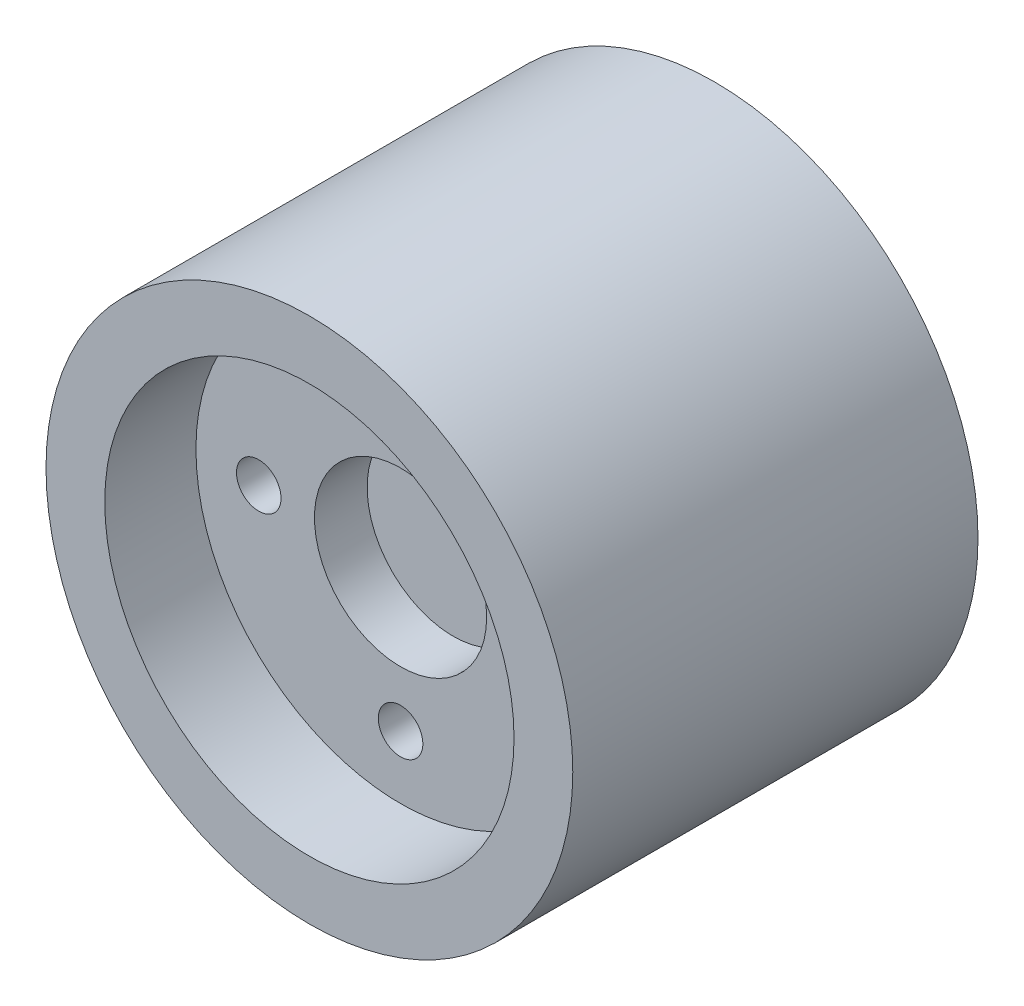
ISO-10303-21;
HEADER;
FILE_DESCRIPTION(('STEP AP214'),'2;1');
FILE_NAME('part.step','',(''),(''),'','','');
FILE_SCHEMA(('AUTOMOTIVE_DESIGN { 1 0 10303 214 1 1 1 1 }'));
ENDSEC;
DATA;
#1=APPLICATION_CONTEXT('core data for automotive mechanical design processes');
#2=APPLICATION_PROTOCOL_DEFINITION('international standard','automotive_design',2000,#1);
#3=PRODUCT_CONTEXT('',#1,'mechanical');
#4=PRODUCT('Part','Part','',(#3));
#5=PRODUCT_RELATED_PRODUCT_CATEGORY('part','',(#4));
#6=PRODUCT_DEFINITION_FORMATION('','',#4);
#7=PRODUCT_DEFINITION_CONTEXT('part definition',#1,'design');
#8=PRODUCT_DEFINITION('design','',#6,#7);
#9=PRODUCT_DEFINITION_SHAPE('','',#8);
#10=(LENGTH_UNIT() NAMED_UNIT(*) SI_UNIT(.MILLI.,.METRE.));
#11=(NAMED_UNIT(*) PLANE_ANGLE_UNIT() SI_UNIT($,.RADIAN.));
#12=(NAMED_UNIT(*) SI_UNIT($,.STERADIAN.) SOLID_ANGLE_UNIT());
#13=UNCERTAINTY_MEASURE_WITH_UNIT(LENGTH_MEASURE(1.E-05),#10,'distance_accuracy_value','');
#14=(GEOMETRIC_REPRESENTATION_CONTEXT(3) GLOBAL_UNCERTAINTY_ASSIGNED_CONTEXT((#13)) GLOBAL_UNIT_ASSIGNED_CONTEXT((#10,
#11,#12)) REPRESENTATION_CONTEXT('',''));
#15=CARTESIAN_POINT('',(0.,0.,0.));
#16=DIRECTION('',(0.,0.,1.));
#17=DIRECTION('',(1.,0.,0.));
#18=AXIS2_PLACEMENT_3D('',#15,#16,#17);
#19=CARTESIAN_POINT('',(0.,0.,20.));
#20=DIRECTION('',(0.,0.,-1.));
#21=DIRECTION('',(-1.,0.,0.));
#22=AXIS2_PLACEMENT_3D('',#19,#20,#21);
#23=CYLINDRICAL_SURFACE('',#22,13.);
#24=CARTESIAN_POINT('',(0.,0.,20.));
#25=DIRECTION('',(0.,0.,1.));
#26=DIRECTION('',(1.,0.,0.));
#27=AXIS2_PLACEMENT_3D('',#24,#25,#26);
#28=CIRCLE('',#27,13.);
#29=CARTESIAN_POINT('',(13.,0.,20.));
#30=VERTEX_POINT('',#29);
#31=EDGE_CURVE('E11',#30,#30,#28,.T.);
#32=ORIENTED_EDGE('',*,*,#31,.F.);
#33=EDGE_LOOP('',(#32));
#34=FACE_BOUND('',#33,.T.);
#35=CARTESIAN_POINT('',(0.,0.,0.));
#36=DIRECTION('',(0.,0.,1.));
#37=DIRECTION('',(1.,0.,0.));
#38=AXIS2_PLACEMENT_3D('',#35,#36,#37);
#39=CIRCLE('',#38,13.);
#40=CARTESIAN_POINT('',(13.,0.,0.));
#41=VERTEX_POINT('',#40);
#42=EDGE_CURVE('E52',#41,#41,#39,.T.);
#43=ORIENTED_EDGE('',*,*,#42,.T.);
#44=EDGE_LOOP('',(#43));
#45=FACE_BOUND('',#44,.T.);
#46=ADVANCED_FACE('F44',(#34,#45),#23,.T.);
#47=CARTESIAN_POINT('',(0.,0.,20.));
#48=DIRECTION('',(0.,0.,1.));
#49=DIRECTION('',(1.,0.,0.));
#50=AXIS2_PLACEMENT_3D('',#47,#48,#49);
#51=PLANE('',#50);
#52=CARTESIAN_POINT('',(0.,0.,20.));
#53=DIRECTION('',(0.,0.,1.));
#54=DIRECTION('',(1.,0.,0.));
#55=AXIS2_PLACEMENT_3D('',#52,#53,#54);
#56=CIRCLE('',#55,10.1);
#57=CARTESIAN_POINT('',(10.1,0.,20.));
#58=VERTEX_POINT('',#57);
#59=EDGE_CURVE('E61',#58,#58,#56,.T.);
#60=ORIENTED_EDGE('',*,*,#59,.F.);
#61=EDGE_LOOP('',(#60));
#62=FACE_BOUND('',#61,.T.);
#63=ORIENTED_EDGE('',*,*,#31,.T.);
#64=EDGE_LOOP('',(#63));
#65=FACE_BOUND('',#64,.T.);
#66=ADVANCED_FACE('F142',(#62,#65),#51,.T.);
#67=CARTESIAN_POINT('',(0.,0.,0.));
#68=DIRECTION('',(0.,0.,1.));
#69=DIRECTION('',(1.,0.,0.));
#70=AXIS2_PLACEMENT_3D('',#67,#68,#69);
#71=PLANE('',#70);
#72=CARTESIAN_POINT('',(6.,5.,0.));
#73=DIRECTION('',(0.,0.,-1.));
#74=DIRECTION('',(-1.,0.,0.));
#75=AXIS2_PLACEMENT_3D('',#72,#73,#74);
#76=CIRCLE('',#75,2.);
#77=CARTESIAN_POINT('',(4.,5.,0.));
#78=VERTEX_POINT('',#77);
#79=EDGE_CURVE('E230',#78,#78,#76,.T.);
#80=ORIENTED_EDGE('',*,*,#79,.F.);
#81=EDGE_LOOP('',(#80));
#82=FACE_BOUND('',#81,.T.);
#83=CARTESIAN_POINT('',(6.,-5.,0.));
#84=DIRECTION('',(0.,0.,-1.));
#85=DIRECTION('',(1.,0.,0.));
#86=AXIS2_PLACEMENT_3D('',#83,#84,#85);
#87=CIRCLE('',#86,2.);
#88=CARTESIAN_POINT('',(8.,-5.,0.));
#89=VERTEX_POINT('',#88);
#90=EDGE_CURVE('E231',#89,#89,#87,.T.);
#91=ORIENTED_EDGE('',*,*,#90,.F.);
#92=EDGE_LOOP('',(#91));
#93=FACE_BOUND('',#92,.T.);
#94=CARTESIAN_POINT('',(0.,7.,0.));
#95=DIRECTION('',(0.,0.,-1.));
#96=DIRECTION('',(-1.,0.,0.));
#97=AXIS2_PLACEMENT_3D('',#94,#95,#96);
#98=CIRCLE('',#97,2.);
#99=CARTESIAN_POINT('',(-2.,7.,0.));
#100=VERTEX_POINT('',#99);
#101=EDGE_CURVE('E91',#100,#100,#98,.T.);
#102=ORIENTED_EDGE('',*,*,#101,.F.);
#103=EDGE_LOOP('',(#102));
#104=FACE_BOUND('',#103,.T.);
#105=CARTESIAN_POINT('',(-7.,0.,0.));
#106=DIRECTION('',(0.,0.,-1.));
#107=DIRECTION('',(-1.,0.,0.));
#108=AXIS2_PLACEMENT_3D('',#105,#106,#107);
#109=CIRCLE('',#108,2.);
#110=CARTESIAN_POINT('',(-9.,0.,0.));
#111=VERTEX_POINT('',#110);
#112=EDGE_CURVE('E96',#111,#111,#109,.T.);
#113=ORIENTED_EDGE('',*,*,#112,.F.);
#114=EDGE_LOOP('',(#113));
#115=FACE_BOUND('',#114,.T.);
#116=CARTESIAN_POINT('',(0.,-7.,0.));
#117=DIRECTION('',(0.,0.,-1.));
#118=DIRECTION('',(-1.,0.,0.));
#119=AXIS2_PLACEMENT_3D('',#116,#117,#118);
#120=CIRCLE('',#119,2.);
#121=CARTESIAN_POINT('',(-2.,-7.,0.));
#122=VERTEX_POINT('',#121);
#123=EDGE_CURVE('E110',#122,#122,#120,.T.);
#124=ORIENTED_EDGE('',*,*,#123,.F.);
#125=EDGE_LOOP('',(#124));
#126=FACE_BOUND('',#125,.T.);
#127=CARTESIAN_POINT('',(0.,0.,0.));
#128=DIRECTION('',(0.,0.,-1.));
#129=DIRECTION('',(-1.,0.,0.));
#130=AXIS2_PLACEMENT_3D('',#127,#128,#129);
#131=CIRCLE('',#130,2.125);
#132=CARTESIAN_POINT('',(-2.125,0.,0.));
#133=VERTEX_POINT('',#132);
#134=EDGE_CURVE('E105',#133,#133,#131,.T.);
#135=ORIENTED_EDGE('',*,*,#134,.F.);
#136=EDGE_LOOP('',(#135));
#137=FACE_BOUND('',#136,.T.);
#138=ORIENTED_EDGE('',*,*,#42,.F.);
#139=EDGE_LOOP('',(#138));
#140=FACE_BOUND('',#139,.T.);
#141=ADVANCED_FACE('F141',(#82,#93,#104,#115,#126,#137,#140),#71,.F.);
#142=CARTESIAN_POINT('',(0.,0.,15.5));
#143=DIRECTION('',(0.,0.,1.));
#144=DIRECTION('',(1.,0.,0.));
#145=AXIS2_PLACEMENT_3D('',#142,#143,#144);
#146=CYLINDRICAL_SURFACE('',#145,10.1);
#147=CARTESIAN_POINT('',(0.,0.,15.5));
#148=DIRECTION('',(0.,0.,1.));
#149=DIRECTION('',(1.,0.,0.));
#150=AXIS2_PLACEMENT_3D('',#147,#148,#149);
#151=CIRCLE('',#150,10.1);
#152=CARTESIAN_POINT('',(10.1,0.,15.5));
#153=VERTEX_POINT('',#152);
#154=EDGE_CURVE('E56',#153,#153,#151,.T.);
#155=ORIENTED_EDGE('',*,*,#154,.F.);
#156=EDGE_LOOP('',(#155));
#157=FACE_BOUND('',#156,.T.);
#158=ORIENTED_EDGE('',*,*,#59,.T.);
#159=EDGE_LOOP('',(#158));
#160=FACE_BOUND('',#159,.T.);
#161=ADVANCED_FACE('F137',(#157,#160),#146,.F.);
#162=CARTESIAN_POINT('',(0.,0.,15.5));
#163=DIRECTION('',(0.,0.,1.));
#164=DIRECTION('',(1.,0.,0.));
#165=AXIS2_PLACEMENT_3D('',#162,#163,#164);
#166=PLANE('',#165);
#167=CARTESIAN_POINT('',(0.,7.,15.5));
#168=DIRECTION('',(0.,0.,1.));
#169=DIRECTION('',(1.,0.,0.));
#170=AXIS2_PLACEMENT_3D('',#167,#168,#169);
#171=CIRCLE('',#170,1.1);
#172=CARTESIAN_POINT('',(1.1,7.,15.5));
#173=VERTEX_POINT('',#172);
#174=EDGE_CURVE('E67',#173,#173,#171,.T.);
#175=ORIENTED_EDGE('',*,*,#174,.F.);
#176=EDGE_LOOP('',(#175));
#177=FACE_BOUND('',#176,.T.);
#178=CARTESIAN_POINT('',(-7.,0.,15.5));
#179=DIRECTION('',(0.,0.,1.));
#180=DIRECTION('',(1.,0.,0.));
#181=AXIS2_PLACEMENT_3D('',#178,#179,#180);
#182=CIRCLE('',#181,1.1);
#183=CARTESIAN_POINT('',(-5.9,0.,15.5));
#184=VERTEX_POINT('',#183);
#185=EDGE_CURVE('E71',#184,#184,#182,.T.);
#186=ORIENTED_EDGE('',*,*,#185,.F.);
#187=EDGE_LOOP('',(#186));
#188=FACE_BOUND('',#187,.T.);
#189=CARTESIAN_POINT('',(0.,-7.,15.5));
#190=DIRECTION('',(0.,0.,1.));
#191=DIRECTION('',(1.,0.,0.));
#192=AXIS2_PLACEMENT_3D('',#189,#190,#191);
#193=CIRCLE('',#192,1.1);
#194=CARTESIAN_POINT('',(1.10000000000005,-7.,15.5));
#195=VERTEX_POINT('',#194);
#196=EDGE_CURVE('E87',#195,#195,#193,.T.);
#197=ORIENTED_EDGE('',*,*,#196,.F.);
#198=EDGE_LOOP('',(#197));
#199=FACE_BOUND('',#198,.T.);
#200=CARTESIAN_POINT('',(0.,0.,15.5));
#201=DIRECTION('',(0.,0.,1.));
#202=DIRECTION('',(1.,0.,0.));
#203=AXIS2_PLACEMENT_3D('',#200,#201,#202);
#204=CIRCLE('',#203,4.25);
#205=CARTESIAN_POINT('',(4.25,0.,15.5));
#206=VERTEX_POINT('',#205);
#207=EDGE_CURVE('E122',#206,#206,#204,.T.);
#208=ORIENTED_EDGE('',*,*,#207,.F.);
#209=EDGE_LOOP('',(#208));
#210=FACE_BOUND('',#209,.T.);
#211=ORIENTED_EDGE('',*,*,#154,.T.);
#212=EDGE_LOOP('',(#211));
#213=FACE_BOUND('',#212,.T.);
#214=ADVANCED_FACE('F153',(#177,#188,#199,#210,#213),#166,.T.);
#215=CARTESIAN_POINT('',(0.,0.,12.9));
#216=DIRECTION('',(0.,0.,1.));
#217=DIRECTION('',(1.,0.,0.));
#218=AXIS2_PLACEMENT_3D('',#215,#216,#217);
#219=CYLINDRICAL_SURFACE('',#218,4.25);
#220=CARTESIAN_POINT('',(0.,0.,12.9));
#221=DIRECTION('',(0.,0.,1.));
#222=DIRECTION('',(1.,0.,0.));
#223=AXIS2_PLACEMENT_3D('',#220,#221,#222);
#224=CIRCLE('',#223,4.25);
#225=CARTESIAN_POINT('',(4.25,0.,12.9));
#226=VERTEX_POINT('',#225);
#227=EDGE_CURVE('E123',#226,#226,#224,.T.);
#228=ORIENTED_EDGE('',*,*,#227,.F.);
#229=EDGE_LOOP('',(#228));
#230=FACE_BOUND('',#229,.T.);
#231=ORIENTED_EDGE('',*,*,#207,.T.);
#232=EDGE_LOOP('',(#231));
#233=FACE_BOUND('',#232,.T.);
#234=ADVANCED_FACE('F156',(#230,#233),#219,.F.);
#235=CARTESIAN_POINT('',(0.,0.,12.9));
#236=DIRECTION('',(0.,0.,1.));
#237=DIRECTION('',(1.,0.,0.));
#238=AXIS2_PLACEMENT_3D('',#235,#236,#237);
#239=PLANE('',#238);
#240=ORIENTED_EDGE('',*,*,#227,.T.);
#241=EDGE_LOOP('',(#240));
#242=FACE_BOUND('',#241,.T.);
#243=ADVANCED_FACE('F162',(#242),#239,.T.);
#244=CARTESIAN_POINT('',(0.,0.,10.));
#245=DIRECTION('',(0.,0.,-1.));
#246=DIRECTION('',(-1.,0.,0.));
#247=AXIS2_PLACEMENT_3D('',#244,#245,#246);
#248=CYLINDRICAL_SURFACE('',#247,2.125);
#249=CARTESIAN_POINT('',(0.,0.,10.));
#250=DIRECTION('',(0.,0.,-1.));
#251=DIRECTION('',(-1.,0.,0.));
#252=AXIS2_PLACEMENT_3D('',#249,#250,#251);
#253=CIRCLE('',#252,2.125);
#254=CARTESIAN_POINT('',(-2.125,0.,10.));
#255=VERTEX_POINT('',#254);
#256=EDGE_CURVE('E120',#255,#255,#253,.T.);
#257=ORIENTED_EDGE('',*,*,#256,.F.);
#258=EDGE_LOOP('',(#257));
#259=FACE_BOUND('',#258,.T.);
#260=ORIENTED_EDGE('',*,*,#134,.T.);
#261=EDGE_LOOP('',(#260));
#262=FACE_BOUND('',#261,.T.);
#263=ADVANCED_FACE('F168',(#259,#262),#248,.F.);
#264=CARTESIAN_POINT('',(0.,0.,10.));
#265=DIRECTION('',(0.,0.,-1.));
#266=DIRECTION('',(-1.,0.,0.));
#267=AXIS2_PLACEMENT_3D('',#264,#265,#266);
#268=PLANE('',#267);
#269=ORIENTED_EDGE('',*,*,#256,.T.);
#270=EDGE_LOOP('',(#269));
#271=FACE_BOUND('',#270,.T.);
#272=ADVANCED_FACE('F167',(#271),#268,.T.);
#273=CARTESIAN_POINT('',(0.,0.,13.5));
#274=DIRECTION('',(0.,0.,1.));
#275=DIRECTION('',(1.,0.,0.));
#276=AXIS2_PLACEMENT_3D('',#273,#274,#275);
#277=PLANE('',#276);
#278=CARTESIAN_POINT('',(0.,-7.,13.5));
#279=DIRECTION('',(0.,0.,1.));
#280=DIRECTION('',(1.,0.,0.));
#281=AXIS2_PLACEMENT_3D('',#278,#279,#280);
#282=CIRCLE('',#281,1.1);
#283=CARTESIAN_POINT('',(1.10000000000005,-7.,13.5));
#284=VERTEX_POINT('',#283);
#285=EDGE_CURVE('E48',#284,#284,#282,.T.);
#286=ORIENTED_EDGE('',*,*,#285,.T.);
#287=EDGE_LOOP('',(#286));
#288=FACE_BOUND('',#287,.T.);
#289=CARTESIAN_POINT('',(0.,-7.,13.5));
#290=DIRECTION('',(0.,0.,1.));
#291=DIRECTION('',(1.,0.,0.));
#292=AXIS2_PLACEMENT_3D('',#289,#290,#291);
#293=CIRCLE('',#292,2.);
#294=CARTESIAN_POINT('',(2.,-7.,13.5));
#295=VERTEX_POINT('',#294);
#296=EDGE_CURVE('E95',#295,#295,#293,.F.);
#297=ORIENTED_EDGE('',*,*,#296,.T.);
#298=EDGE_LOOP('',(#297));
#299=FACE_BOUND('',#298,.T.);
#300=ADVANCED_FACE('F172',(#288,#299),#277,.F.);
#301=CARTESIAN_POINT('',(0.,-7.,21.1568542494924));
#302=DIRECTION('',(0.,0.,-1.));
#303=DIRECTION('',(-1.,0.,0.));
#304=AXIS2_PLACEMENT_3D('',#301,#302,#303);
#305=CYLINDRICAL_SURFACE('',#304,2.);
#306=ORIENTED_EDGE('',*,*,#123,.T.);
#307=EDGE_LOOP('',(#306));
#308=FACE_BOUND('',#307,.T.);
#309=ORIENTED_EDGE('',*,*,#296,.F.);
#310=EDGE_LOOP('',(#309));
#311=FACE_BOUND('',#310,.T.);
#312=ADVANCED_FACE('F176',(#308,#311),#305,.F.);
#313=CARTESIAN_POINT('',(0.,0.,13.5));
#314=DIRECTION('',(0.,0.,1.));
#315=DIRECTION('',(1.,0.,0.));
#316=AXIS2_PLACEMENT_3D('',#313,#314,#315);
#317=PLANE('',#316);
#318=CARTESIAN_POINT('',(-7.,0.,13.5));
#319=DIRECTION('',(0.,0.,1.));
#320=DIRECTION('',(1.,0.,0.));
#321=AXIS2_PLACEMENT_3D('',#318,#319,#320);
#322=CIRCLE('',#321,1.1);
#323=CARTESIAN_POINT('',(-5.9,0.,13.5));
#324=VERTEX_POINT('',#323);
#325=EDGE_CURVE('E69',#324,#324,#322,.T.);
#326=ORIENTED_EDGE('',*,*,#325,.T.);
#327=EDGE_LOOP('',(#326));
#328=FACE_BOUND('',#327,.T.);
#329=CARTESIAN_POINT('',(-7.,0.,13.5));
#330=DIRECTION('',(0.,0.,1.));
#331=DIRECTION('',(1.,0.,0.));
#332=AXIS2_PLACEMENT_3D('',#329,#330,#331);
#333=CIRCLE('',#332,2.);
#334=CARTESIAN_POINT('',(-5.,0.,13.5));
#335=VERTEX_POINT('',#334);
#336=EDGE_CURVE('E101',#335,#335,#333,.F.);
#337=ORIENTED_EDGE('',*,*,#336,.T.);
#338=EDGE_LOOP('',(#337));
#339=FACE_BOUND('',#338,.T.);
#340=ADVANCED_FACE('F177',(#328,#339),#317,.F.);
#341=CARTESIAN_POINT('',(-7.,0.,21.1568542494924));
#342=DIRECTION('',(0.,0.,-1.));
#343=DIRECTION('',(-1.,0.,0.));
#344=AXIS2_PLACEMENT_3D('',#341,#342,#343);
#345=CYLINDRICAL_SURFACE('',#344,2.);
#346=ORIENTED_EDGE('',*,*,#112,.T.);
#347=EDGE_LOOP('',(#346));
#348=FACE_BOUND('',#347,.T.);
#349=ORIENTED_EDGE('',*,*,#336,.F.);
#350=EDGE_LOOP('',(#349));
#351=FACE_BOUND('',#350,.T.);
#352=ADVANCED_FACE('F183',(#348,#351),#345,.F.);
#353=CARTESIAN_POINT('',(0.,0.,13.5));
#354=DIRECTION('',(0.,0.,1.));
#355=DIRECTION('',(1.,0.,0.));
#356=AXIS2_PLACEMENT_3D('',#353,#354,#355);
#357=PLANE('',#356);
#358=CARTESIAN_POINT('',(0.,7.,13.5));
#359=DIRECTION('',(0.,0.,1.));
#360=DIRECTION('',(1.,0.,0.));
#361=AXIS2_PLACEMENT_3D('',#358,#359,#360);
#362=CIRCLE('',#361,1.1);
#363=CARTESIAN_POINT('',(1.1,7.,13.5));
#364=VERTEX_POINT('',#363);
#365=EDGE_CURVE('E62',#364,#364,#362,.T.);
#366=ORIENTED_EDGE('',*,*,#365,.T.);
#367=EDGE_LOOP('',(#366));
#368=FACE_BOUND('',#367,.T.);
#369=CARTESIAN_POINT('',(0.,7.,13.5));
#370=DIRECTION('',(0.,0.,1.));
#371=DIRECTION('',(1.,0.,0.));
#372=AXIS2_PLACEMENT_3D('',#369,#370,#371);
#373=CIRCLE('',#372,2.);
#374=CARTESIAN_POINT('',(2.,7.,13.5));
#375=VERTEX_POINT('',#374);
#376=EDGE_CURVE('E97',#375,#375,#373,.F.);
#377=ORIENTED_EDGE('',*,*,#376,.T.);
#378=EDGE_LOOP('',(#377));
#379=FACE_BOUND('',#378,.T.);
#380=ADVANCED_FACE('F190',(#368,#379),#357,.F.);
#381=CARTESIAN_POINT('',(0.,7.,21.1568542494924));
#382=DIRECTION('',(0.,0.,-1.));
#383=DIRECTION('',(-1.,0.,0.));
#384=AXIS2_PLACEMENT_3D('',#381,#382,#383);
#385=CYLINDRICAL_SURFACE('',#384,2.);
#386=ORIENTED_EDGE('',*,*,#101,.T.);
#387=EDGE_LOOP('',(#386));
#388=FACE_BOUND('',#387,.T.);
#389=ORIENTED_EDGE('',*,*,#376,.F.);
#390=EDGE_LOOP('',(#389));
#391=FACE_BOUND('',#390,.T.);
#392=ADVANCED_FACE('F195',(#388,#391),#385,.F.);
#393=CARTESIAN_POINT('',(0.,7.,20.));
#394=DIRECTION('',(0.,0.,-1.));
#395=DIRECTION('',(-1.,0.,0.));
#396=AXIS2_PLACEMENT_3D('',#393,#394,#395);
#397=CYLINDRICAL_SURFACE('',#396,1.1);
#398=ORIENTED_EDGE('',*,*,#174,.T.);
#399=EDGE_LOOP('',(#398));
#400=FACE_BOUND('',#399,.T.);
#401=ORIENTED_EDGE('',*,*,#365,.F.);
#402=EDGE_LOOP('',(#401));
#403=FACE_BOUND('',#402,.T.);
#404=ADVANCED_FACE('F200',(#400,#403),#397,.F.);
#405=CARTESIAN_POINT('',(-7.,0.,20.));
#406=DIRECTION('',(0.,0.,-1.));
#407=DIRECTION('',(-1.,0.,0.));
#408=AXIS2_PLACEMENT_3D('',#405,#406,#407);
#409=CYLINDRICAL_SURFACE('',#408,1.1);
#410=ORIENTED_EDGE('',*,*,#185,.T.);
#411=EDGE_LOOP('',(#410));
#412=FACE_BOUND('',#411,.T.);
#413=ORIENTED_EDGE('',*,*,#325,.F.);
#414=EDGE_LOOP('',(#413));
#415=FACE_BOUND('',#414,.T.);
#416=ADVANCED_FACE('F201',(#412,#415),#409,.F.);
#417=CARTESIAN_POINT('',(0.,-7.,20.));
#418=DIRECTION('',(0.,0.,-1.));
#419=DIRECTION('',(-1.,0.,0.));
#420=AXIS2_PLACEMENT_3D('',#417,#418,#419);
#421=CYLINDRICAL_SURFACE('',#420,1.1);
#422=ORIENTED_EDGE('',*,*,#196,.T.);
#423=EDGE_LOOP('',(#422));
#424=FACE_BOUND('',#423,.T.);
#425=ORIENTED_EDGE('',*,*,#285,.F.);
#426=EDGE_LOOP('',(#425));
#427=FACE_BOUND('',#426,.T.);
#428=ADVANCED_FACE('F198',(#424,#427),#421,.F.);
#429=CARTESIAN_POINT('',(6.,-5.,6.));
#430=DIRECTION('',(0.,0.,-1.));
#431=DIRECTION('',(-1.,0.,0.));
#432=AXIS2_PLACEMENT_3D('',#429,#430,#431);
#433=CYLINDRICAL_SURFACE('',#432,2.);
#434=CARTESIAN_POINT('',(6.,-5.,6.));
#435=DIRECTION('',(0.,0.,-1.));
#436=DIRECTION('',(1.,0.,0.));
#437=AXIS2_PLACEMENT_3D('',#434,#435,#436);
#438=CIRCLE('',#437,2.);
#439=CARTESIAN_POINT('',(8.,-5.,6.));
#440=VERTEX_POINT('',#439);
#441=EDGE_CURVE('E82',#440,#440,#438,.T.);
#442=ORIENTED_EDGE('',*,*,#441,.F.);
#443=EDGE_LOOP('',(#442));
#444=FACE_BOUND('',#443,.T.);
#445=ORIENTED_EDGE('',*,*,#90,.T.);
#446=EDGE_LOOP('',(#445));
#447=FACE_BOUND('',#446,.T.);
#448=ADVANCED_FACE('F205',(#444,#447),#433,.F.);
#449=CARTESIAN_POINT('',(6.,-5.,6.));
#450=DIRECTION('',(0.,0.,1.));
#451=DIRECTION('',(1.,0.,0.));
#452=AXIS2_PLACEMENT_3D('',#449,#450,#451);
#453=PLANE('',#452);
#454=ORIENTED_EDGE('',*,*,#441,.T.);
#455=EDGE_LOOP('',(#454));
#456=FACE_BOUND('',#455,.T.);
#457=ADVANCED_FACE('F208',(#456),#453,.F.);
#458=CARTESIAN_POINT('',(6.,5.,6.));
#459=DIRECTION('',(0.,0.,-1.));
#460=DIRECTION('',(-1.,0.,0.));
#461=AXIS2_PLACEMENT_3D('',#458,#459,#460);
#462=CYLINDRICAL_SURFACE('',#461,2.);
#463=CARTESIAN_POINT('',(6.,5.,6.));
#464=DIRECTION('',(0.,0.,-1.));
#465=DIRECTION('',(-1.,0.,0.));
#466=AXIS2_PLACEMENT_3D('',#463,#464,#465);
#467=CIRCLE('',#466,2.);
#468=CARTESIAN_POINT('',(4.,5.,6.));
#469=VERTEX_POINT('',#468);
#470=EDGE_CURVE('E68',#469,#469,#467,.T.);
#471=ORIENTED_EDGE('',*,*,#470,.F.);
#472=EDGE_LOOP('',(#471));
#473=FACE_BOUND('',#472,.T.);
#474=ORIENTED_EDGE('',*,*,#79,.T.);
#475=EDGE_LOOP('',(#474));
#476=FACE_BOUND('',#475,.T.);
#477=ADVANCED_FACE('F215',(#473,#476),#462,.F.);
#478=CARTESIAN_POINT('',(6.,5.,6.));
#479=DIRECTION('',(0.,0.,-1.));
#480=DIRECTION('',(-1.,0.,0.));
#481=AXIS2_PLACEMENT_3D('',#478,#479,#480);
#482=PLANE('',#481);
#483=ORIENTED_EDGE('',*,*,#470,.T.);
#484=EDGE_LOOP('',(#483));
#485=FACE_BOUND('',#484,.T.);
#486=ADVANCED_FACE('F219',(#485),#482,.T.);
#487=CLOSED_SHELL('',(#46,#66,#141,#161,#214,#234,#243,#263,#272,#300,#312,#340,#352,#380,#392,
#404,#416,#428,#448,#457,#477,#486));
#488=MANIFOLD_SOLID_BREP('B2',#487);
#489=ADVANCED_BREP_SHAPE_REPRESENTATION('',(#18,#488),#14);
#490=SHAPE_DEFINITION_REPRESENTATION(#9,#489);
ENDSEC;
END-ISO-10303-21;
